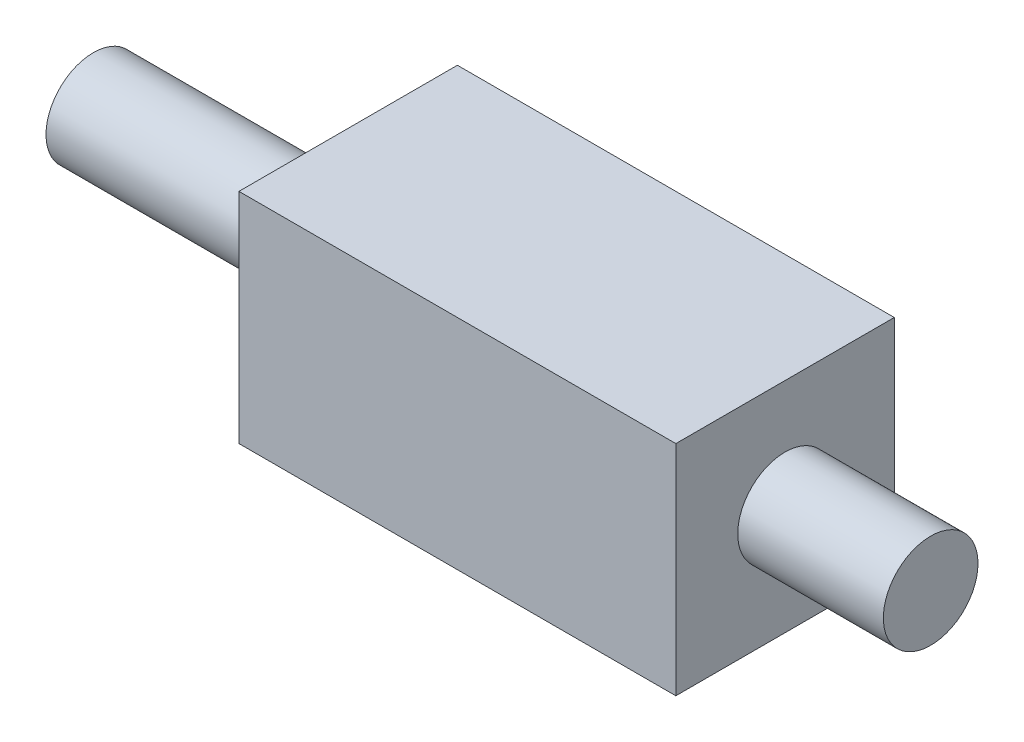
ISO-10303-21;
HEADER;
FILE_DESCRIPTION(('STEP AP214'),'2;1');
FILE_NAME('part.step','',(''),(''),'','','');
FILE_SCHEMA(('AUTOMOTIVE_DESIGN { 1 0 10303 214 1 1 1 1 }'));
ENDSEC;
DATA;
#1=APPLICATION_CONTEXT('core data for automotive mechanical design processes');
#2=APPLICATION_PROTOCOL_DEFINITION('international standard','automotive_design',2000,#1);
#3=PRODUCT_CONTEXT('',#1,'mechanical');
#4=PRODUCT('Part','Part','',(#3));
#5=PRODUCT_RELATED_PRODUCT_CATEGORY('part','',(#4));
#6=PRODUCT_DEFINITION_FORMATION('','',#4);
#7=PRODUCT_DEFINITION_CONTEXT('part definition',#1,'design');
#8=PRODUCT_DEFINITION('design','',#6,#7);
#9=PRODUCT_DEFINITION_SHAPE('','',#8);
#10=(LENGTH_UNIT() NAMED_UNIT(*) SI_UNIT(.MILLI.,.METRE.));
#11=(NAMED_UNIT(*) PLANE_ANGLE_UNIT() SI_UNIT($,.RADIAN.));
#12=(NAMED_UNIT(*) SI_UNIT($,.STERADIAN.) SOLID_ANGLE_UNIT());
#13=UNCERTAINTY_MEASURE_WITH_UNIT(LENGTH_MEASURE(1.E-05),#10,'distance_accuracy_value','');
#14=(GEOMETRIC_REPRESENTATION_CONTEXT(3) GLOBAL_UNCERTAINTY_ASSIGNED_CONTEXT((#13)) GLOBAL_UNIT_ASSIGNED_CONTEXT((#10,
#11,#12)) REPRESENTATION_CONTEXT('',''));
#15=CARTESIAN_POINT('',(0.,0.,0.));
#16=DIRECTION('',(0.,0.,1.));
#17=DIRECTION('',(1.,0.,0.));
#18=AXIS2_PLACEMENT_3D('',#15,#16,#17);
#19=CARTESIAN_POINT('',(6.,-1.,1.5));
#20=DIRECTION('',(0.,0.,-1.));
#21=DIRECTION('',(-1.,0.,0.));
#22=AXIS2_PLACEMENT_3D('',#19,#20,#21);
#23=PLANE('',#22);
#24=DIRECTION('',(0.,-1.,0.));
#25=VECTOR('',#24,1.);
#26=CARTESIAN_POINT('',(0.,-1.,1.5));
#27=LINE('',#26,#25);
#28=CARTESIAN_POINT('',(0.,2.,1.5));
#29=VERTEX_POINT('',#28);
#30=CARTESIAN_POINT('',(0.,-1.,1.5));
#31=VERTEX_POINT('',#30);
#32=EDGE_CURVE('E101',#29,#31,#27,.T.);
#33=ORIENTED_EDGE('',*,*,#32,.T.);
#34=DIRECTION('',(-1.,0.,0.));
#35=VECTOR('',#34,1.);
#36=CARTESIAN_POINT('',(6.,-1.,1.5));
#37=LINE('',#36,#35);
#38=CARTESIAN_POINT('',(6.,-1.,1.5));
#39=VERTEX_POINT('',#38);
#40=EDGE_CURVE('E43',#39,#31,#37,.T.);
#41=ORIENTED_EDGE('',*,*,#40,.F.);
#42=DIRECTION('',(0.,-1.,0.));
#43=VECTOR('',#42,1.);
#44=CARTESIAN_POINT('',(6.,-1.,1.5));
#45=LINE('',#44,#43);
#46=CARTESIAN_POINT('',(6.,2.,1.5));
#47=VERTEX_POINT('',#46);
#48=EDGE_CURVE('E87',#47,#39,#45,.T.);
#49=ORIENTED_EDGE('',*,*,#48,.F.);
#50=DIRECTION('',(-1.,0.,0.));
#51=VECTOR('',#50,1.);
#52=CARTESIAN_POINT('',(6.,2.,1.5));
#53=LINE('',#52,#51);
#54=EDGE_CURVE('E97',#47,#29,#53,.T.);
#55=ORIENTED_EDGE('',*,*,#54,.T.);
#56=EDGE_LOOP('',(#33,#41,#49,#55));
#57=FACE_BOUND('',#56,.T.);
#58=ADVANCED_FACE('F35',(#57),#23,.F.);
#59=CARTESIAN_POINT('',(6.,-1.,-1.5));
#60=DIRECTION('',(0.,1.,0.));
#61=DIRECTION('',(0.,0.,1.));
#62=AXIS2_PLACEMENT_3D('',#59,#60,#61);
#63=PLANE('',#62);
#64=DIRECTION('',(0.,0.,-1.));
#65=VECTOR('',#64,1.);
#66=CARTESIAN_POINT('',(0.,-1.,-1.5));
#67=LINE('',#66,#65);
#68=CARTESIAN_POINT('',(0.,-1.,-1.5));
#69=VERTEX_POINT('',#68);
#70=EDGE_CURVE('E92',#31,#69,#67,.T.);
#71=ORIENTED_EDGE('',*,*,#70,.T.);
#72=DIRECTION('',(-1.,0.,0.));
#73=VECTOR('',#72,1.);
#74=CARTESIAN_POINT('',(6.,-1.,-1.5));
#75=LINE('',#74,#73);
#76=CARTESIAN_POINT('',(6.,-1.,-1.5));
#77=VERTEX_POINT('',#76);
#78=EDGE_CURVE('E90',#77,#69,#75,.T.);
#79=ORIENTED_EDGE('',*,*,#78,.F.);
#80=DIRECTION('',(0.,0.,-1.));
#81=VECTOR('',#80,1.);
#82=CARTESIAN_POINT('',(6.,-1.,-1.5));
#83=LINE('',#82,#81);
#84=EDGE_CURVE('E82',#39,#77,#83,.T.);
#85=ORIENTED_EDGE('',*,*,#84,.F.);
#86=ORIENTED_EDGE('',*,*,#40,.T.);
#87=EDGE_LOOP('',(#71,#79,#85,#86));
#88=FACE_BOUND('',#87,.T.);
#89=ADVANCED_FACE('F91',(#88),#63,.F.);
#90=CARTESIAN_POINT('',(6.,-1.,-1.5));
#91=DIRECTION('',(0.,0.,1.));
#92=DIRECTION('',(1.,0.,0.));
#93=AXIS2_PLACEMENT_3D('',#90,#91,#92);
#94=PLANE('',#93);
#95=DIRECTION('',(0.,1.,0.));
#96=VECTOR('',#95,1.);
#97=CARTESIAN_POINT('',(0.,-1.,-1.5));
#98=LINE('',#97,#96);
#99=CARTESIAN_POINT('',(0.,2.,-1.5));
#100=VERTEX_POINT('',#99);
#101=EDGE_CURVE('E68',#69,#100,#98,.T.);
#102=ORIENTED_EDGE('',*,*,#101,.T.);
#103=DIRECTION('',(-1.,0.,0.));
#104=VECTOR('',#103,1.);
#105=CARTESIAN_POINT('',(6.,2.,-1.5));
#106=LINE('',#105,#104);
#107=CARTESIAN_POINT('',(6.,2.,-1.5));
#108=VERTEX_POINT('',#107);
#109=EDGE_CURVE('E93',#108,#100,#106,.T.);
#110=ORIENTED_EDGE('',*,*,#109,.F.);
#111=DIRECTION('',(0.,1.,0.));
#112=VECTOR('',#111,1.);
#113=CARTESIAN_POINT('',(6.,-1.,-1.5));
#114=LINE('',#113,#112);
#115=EDGE_CURVE('E85',#77,#108,#114,.T.);
#116=ORIENTED_EDGE('',*,*,#115,.F.);
#117=ORIENTED_EDGE('',*,*,#78,.T.);
#118=EDGE_LOOP('',(#102,#110,#116,#117));
#119=FACE_BOUND('',#118,.T.);
#120=ADVANCED_FACE('F95',(#119),#94,.F.);
#121=CARTESIAN_POINT('',(6.,2.,-1.5));
#122=DIRECTION('',(0.,-1.,0.));
#123=DIRECTION('',(0.,0.,-1.));
#124=AXIS2_PLACEMENT_3D('',#121,#122,#123);
#125=PLANE('',#124);
#126=DIRECTION('',(0.,0.,1.));
#127=VECTOR('',#126,1.);
#128=CARTESIAN_POINT('',(0.,2.,-1.5));
#129=LINE('',#128,#127);
#130=EDGE_CURVE('E74',#100,#29,#129,.T.);
#131=ORIENTED_EDGE('',*,*,#130,.T.);
#132=ORIENTED_EDGE('',*,*,#54,.F.);
#133=DIRECTION('',(0.,0.,1.));
#134=VECTOR('',#133,1.);
#135=CARTESIAN_POINT('',(6.,2.,-1.5));
#136=LINE('',#135,#134);
#137=EDGE_CURVE('E51',#108,#47,#136,.T.);
#138=ORIENTED_EDGE('',*,*,#137,.F.);
#139=ORIENTED_EDGE('',*,*,#109,.T.);
#140=EDGE_LOOP('',(#131,#132,#138,#139));
#141=FACE_BOUND('',#140,.T.);
#142=ADVANCED_FACE('F124',(#141),#125,.F.);
#143=CARTESIAN_POINT('',(6.,0.,0.));
#144=DIRECTION('',(1.,0.,0.));
#145=DIRECTION('',(0.,0.,-1.));
#146=AXIS2_PLACEMENT_3D('',#143,#144,#145);
#147=PLANE('',#146);
#148=CARTESIAN_POINT('',(6.,0.5,0.));
#149=DIRECTION('',(1.,0.,0.));
#150=DIRECTION('',(0.,0.,-1.));
#151=AXIS2_PLACEMENT_3D('',#148,#149,#150);
#152=CIRCLE('',#151,0.65);
#153=CARTESIAN_POINT('',(6.,0.5,-0.649999999999999));
#154=VERTEX_POINT('',#153);
#155=EDGE_CURVE('E184',#154,#154,#152,.T.);
#156=ORIENTED_EDGE('',*,*,#155,.F.);
#157=EDGE_LOOP('',(#156));
#158=FACE_BOUND('',#157,.T.);
#159=ORIENTED_EDGE('',*,*,#48,.T.);
#160=ORIENTED_EDGE('',*,*,#84,.T.);
#161=ORIENTED_EDGE('',*,*,#115,.T.);
#162=ORIENTED_EDGE('',*,*,#137,.T.);
#163=EDGE_LOOP('',(#159,#160,#161,#162));
#164=FACE_BOUND('',#163,.T.);
#165=ADVANCED_FACE('F83',(#158,#164),#147,.T.);
#166=CARTESIAN_POINT('',(0.,0.,0.));
#167=DIRECTION('',(1.,0.,0.));
#168=DIRECTION('',(0.,0.,-1.));
#169=AXIS2_PLACEMENT_3D('',#166,#167,#168);
#170=PLANE('',#169);
#171=CARTESIAN_POINT('',(0.,0.5,0.));
#172=DIRECTION('',(1.,0.,0.));
#173=DIRECTION('',(0.,0.,-1.));
#174=AXIS2_PLACEMENT_3D('',#171,#172,#173);
#175=CIRCLE('',#174,0.65);
#176=CARTESIAN_POINT('',(0.,0.5,-0.65));
#177=VERTEX_POINT('',#176);
#178=EDGE_CURVE('E11',#177,#177,#175,.F.);
#179=ORIENTED_EDGE('',*,*,#178,.F.);
#180=EDGE_LOOP('',(#179));
#181=FACE_BOUND('',#180,.T.);
#182=ORIENTED_EDGE('',*,*,#32,.F.);
#183=ORIENTED_EDGE('',*,*,#130,.F.);
#184=ORIENTED_EDGE('',*,*,#101,.F.);
#185=ORIENTED_EDGE('',*,*,#70,.F.);
#186=EDGE_LOOP('',(#182,#183,#184,#185));
#187=FACE_BOUND('',#186,.T.);
#188=ADVANCED_FACE('F112',(#181,#187),#170,.F.);
#189=CARTESIAN_POINT('',(-3.5,0.5,0.));
#190=DIRECTION('',(1.,0.,0.));
#191=DIRECTION('',(0.,0.,-1.));
#192=AXIS2_PLACEMENT_3D('',#189,#190,#191);
#193=CYLINDRICAL_SURFACE('',#192,0.65);
#194=CARTESIAN_POINT('',(-3.5,0.5,0.));
#195=DIRECTION('',(-1.,0.,0.));
#196=DIRECTION('',(0.,0.,1.));
#197=AXIS2_PLACEMENT_3D('',#194,#195,#196);
#198=CIRCLE('',#197,0.65);
#199=CARTESIAN_POINT('',(-3.5,0.5,0.65));
#200=VERTEX_POINT('',#199);
#201=EDGE_CURVE('E104',#200,#200,#198,.T.);
#202=ORIENTED_EDGE('',*,*,#201,.F.);
#203=EDGE_LOOP('',(#202));
#204=FACE_BOUND('',#203,.T.);
#205=ORIENTED_EDGE('',*,*,#178,.T.);
#206=EDGE_LOOP('',(#205));
#207=FACE_BOUND('',#206,.T.);
#208=ADVANCED_FACE('F114',(#204,#207),#193,.T.);
#209=CARTESIAN_POINT('',(-3.5,0.5,0.));
#210=DIRECTION('',(-1.,0.,0.));
#211=DIRECTION('',(0.,0.,1.));
#212=AXIS2_PLACEMENT_3D('',#209,#210,#211);
#213=PLANE('',#212);
#214=ORIENTED_EDGE('',*,*,#201,.T.);
#215=EDGE_LOOP('',(#214));
#216=FACE_BOUND('',#215,.T.);
#217=ADVANCED_FACE('F121',(#216),#213,.T.);
#218=CARTESIAN_POINT('',(8.,0.5,0.));
#219=DIRECTION('',(-1.,0.,0.));
#220=DIRECTION('',(0.,0.,1.));
#221=AXIS2_PLACEMENT_3D('',#218,#219,#220);
#222=CYLINDRICAL_SURFACE('',#221,0.65);
#223=CARTESIAN_POINT('',(8.,0.5,0.));
#224=DIRECTION('',(1.,0.,0.));
#225=DIRECTION('',(0.,0.,-1.));
#226=AXIS2_PLACEMENT_3D('',#223,#224,#225);
#227=CIRCLE('',#226,0.65);
#228=CARTESIAN_POINT('',(8.,0.5,-0.649999999999999));
#229=VERTEX_POINT('',#228);
#230=EDGE_CURVE('E182',#229,#229,#227,.T.);
#231=ORIENTED_EDGE('',*,*,#230,.F.);
#232=EDGE_LOOP('',(#231));
#233=FACE_BOUND('',#232,.T.);
#234=ORIENTED_EDGE('',*,*,#155,.T.);
#235=EDGE_LOOP('',(#234));
#236=FACE_BOUND('',#235,.T.);
#237=ADVANCED_FACE('F157',(#233,#236),#222,.T.);
#238=CARTESIAN_POINT('',(8.,0.5,0.));
#239=DIRECTION('',(1.,0.,0.));
#240=DIRECTION('',(0.,0.,-1.));
#241=AXIS2_PLACEMENT_3D('',#238,#239,#240);
#242=PLANE('',#241);
#243=ORIENTED_EDGE('',*,*,#230,.T.);
#244=EDGE_LOOP('',(#243));
#245=FACE_BOUND('',#244,.T.);
#246=ADVANCED_FACE('F162',(#245),#242,.T.);
#247=CLOSED_SHELL('',(#58,#89,#120,#142,#165,#188,#208,#217,#237,#246));
#248=MANIFOLD_SOLID_BREP('B2',#247);
#249=ADVANCED_BREP_SHAPE_REPRESENTATION('',(#18,#248),#14);
#250=SHAPE_DEFINITION_REPRESENTATION(#9,#249);
ENDSEC;
END-ISO-10303-21;
